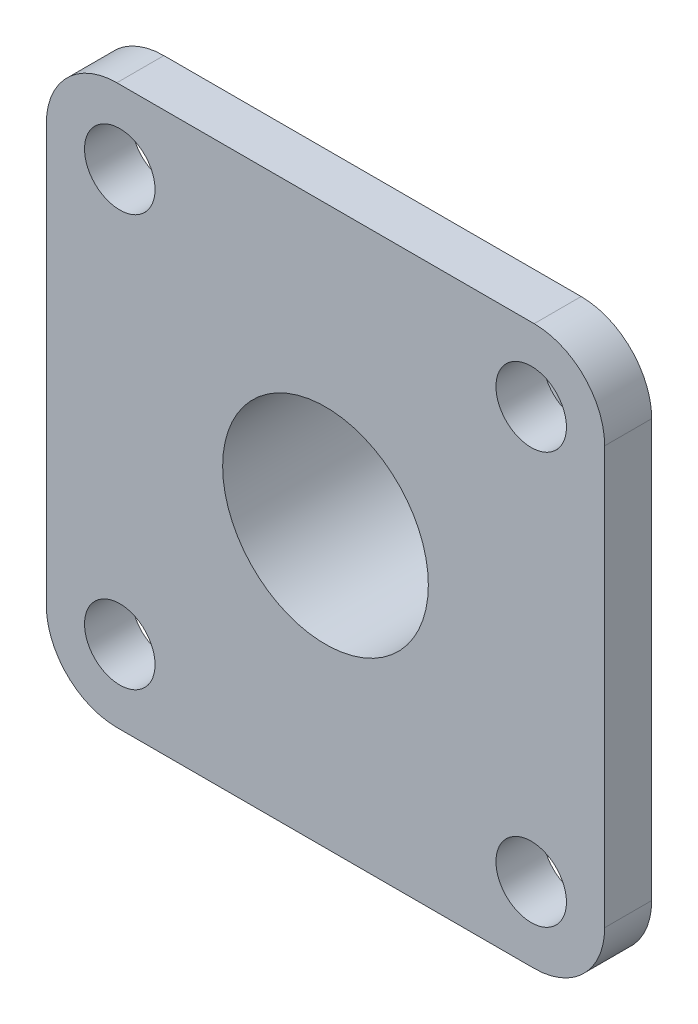
ISO-10303-21;
HEADER;
FILE_DESCRIPTION(('STEP AP214'),'2;1');
FILE_NAME('part.step','',(''),(''),'','','');
FILE_SCHEMA(('AUTOMOTIVE_DESIGN { 1 0 10303 214 1 1 1 1 }'));
ENDSEC;
DATA;
#1=APPLICATION_CONTEXT('core data for automotive mechanical design processes');
#2=APPLICATION_PROTOCOL_DEFINITION('international standard','automotive_design',2000,#1);
#3=PRODUCT_CONTEXT('',#1,'mechanical');
#4=PRODUCT('Part','Part','',(#3));
#5=PRODUCT_RELATED_PRODUCT_CATEGORY('part','',(#4));
#6=PRODUCT_DEFINITION_FORMATION('','',#4);
#7=PRODUCT_DEFINITION_CONTEXT('part definition',#1,'design');
#8=PRODUCT_DEFINITION('design','',#6,#7);
#9=PRODUCT_DEFINITION_SHAPE('','',#8);
#10=(LENGTH_UNIT() NAMED_UNIT(*) SI_UNIT(.MILLI.,.METRE.));
#11=(NAMED_UNIT(*) PLANE_ANGLE_UNIT() SI_UNIT($,.RADIAN.));
#12=(NAMED_UNIT(*) SI_UNIT($,.STERADIAN.) SOLID_ANGLE_UNIT());
#13=UNCERTAINTY_MEASURE_WITH_UNIT(LENGTH_MEASURE(1.E-05),#10,'distance_accuracy_value','');
#14=(GEOMETRIC_REPRESENTATION_CONTEXT(3) GLOBAL_UNCERTAINTY_ASSIGNED_CONTEXT((#13)) GLOBAL_UNIT_ASSIGNED_CONTEXT((#10,
#11,#12)) REPRESENTATION_CONTEXT('',''));
#15=CARTESIAN_POINT('',(0.,0.,0.));
#16=DIRECTION('',(0.,0.,1.));
#17=DIRECTION('',(1.,0.,0.));
#18=AXIS2_PLACEMENT_3D('',#15,#16,#17);
#19=CARTESIAN_POINT('',(-35.5,35.5,0.));
#20=DIRECTION('',(0.,0.,1.));
#21=DIRECTION('',(1.,0.,0.));
#22=AXIS2_PLACEMENT_3D('',#19,#20,#21);
#23=PLANE('',#22);
#24=CARTESIAN_POINT('',(-35.,35.,0.));
#25=DIRECTION('',(0.,0.,1.));
#26=DIRECTION('',(1.,0.,0.));
#27=AXIS2_PLACEMENT_3D('',#24,#25,#26);
#28=CIRCLE('',#27,6.);
#29=CARTESIAN_POINT('',(-29.,35.,0.));
#30=VERTEX_POINT('',#29);
#31=EDGE_CURVE('E202',#30,#30,#28,.T.);
#32=ORIENTED_EDGE('',*,*,#31,.T.);
#33=EDGE_LOOP('',(#32));
#34=FACE_BOUND('',#33,.T.);
#35=CARTESIAN_POINT('',(35.,35.,0.));
#36=DIRECTION('',(0.,0.,1.));
#37=DIRECTION('',(1.,0.,0.));
#38=AXIS2_PLACEMENT_3D('',#35,#36,#37);
#39=CIRCLE('',#38,6.);
#40=CARTESIAN_POINT('',(41.,35.,0.));
#41=VERTEX_POINT('',#40);
#42=EDGE_CURVE('E196',#41,#41,#39,.T.);
#43=ORIENTED_EDGE('',*,*,#42,.T.);
#44=EDGE_LOOP('',(#43));
#45=FACE_BOUND('',#44,.T.);
#46=CARTESIAN_POINT('',(35.,-35.,0.));
#47=DIRECTION('',(0.,0.,1.));
#48=DIRECTION('',(1.,0.,0.));
#49=AXIS2_PLACEMENT_3D('',#46,#47,#48);
#50=CIRCLE('',#49,6.00000000000001);
#51=CARTESIAN_POINT('',(41.,-35.,0.));
#52=VERTEX_POINT('',#51);
#53=EDGE_CURVE('E190',#52,#52,#50,.T.);
#54=ORIENTED_EDGE('',*,*,#53,.T.);
#55=EDGE_LOOP('',(#54));
#56=FACE_BOUND('',#55,.T.);
#57=CARTESIAN_POINT('',(-35.,-35.,0.));
#58=DIRECTION('',(0.,0.,1.));
#59=DIRECTION('',(1.,0.,0.));
#60=AXIS2_PLACEMENT_3D('',#57,#58,#59);
#61=CIRCLE('',#60,6.);
#62=CARTESIAN_POINT('',(-29.,-35.,0.));
#63=VERTEX_POINT('',#62);
#64=EDGE_CURVE('E184',#63,#63,#61,.T.);
#65=ORIENTED_EDGE('',*,*,#64,.T.);
#66=EDGE_LOOP('',(#65));
#67=FACE_BOUND('',#66,.T.);
#68=CARTESIAN_POINT('',(-35.5,35.5,0.));
#69=DIRECTION('',(0.,0.,1.));
#70=DIRECTION('',(1.,0.,0.));
#71=AXIS2_PLACEMENT_3D('',#68,#69,#70);
#72=CIRCLE('',#71,12.);
#73=CARTESIAN_POINT('',(-35.5,47.5,0.));
#74=VERTEX_POINT('',#73);
#75=CARTESIAN_POINT('',(-47.5,35.5,0.));
#76=VERTEX_POINT('',#75);
#77=EDGE_CURVE('E132',#74,#76,#72,.T.);
#78=ORIENTED_EDGE('',*,*,#77,.F.);
#79=DIRECTION('',(-1.,0.,0.));
#80=VECTOR('',#79,1.);
#81=CARTESIAN_POINT('',(35.5,47.5,0.));
#82=LINE('',#81,#80);
#83=CARTESIAN_POINT('',(35.5,47.5,0.));
#84=VERTEX_POINT('',#83);
#85=EDGE_CURVE('E85',#84,#74,#82,.T.);
#86=ORIENTED_EDGE('',*,*,#85,.F.);
#87=CARTESIAN_POINT('',(35.5,35.5,0.));
#88=DIRECTION('',(0.,0.,1.));
#89=DIRECTION('',(1.,0.,0.));
#90=AXIS2_PLACEMENT_3D('',#87,#88,#89);
#91=CIRCLE('',#90,12.);
#92=CARTESIAN_POINT('',(47.5,35.5,0.));
#93=VERTEX_POINT('',#92);
#94=EDGE_CURVE('E79',#93,#84,#91,.T.);
#95=ORIENTED_EDGE('',*,*,#94,.F.);
#96=DIRECTION('',(0.,1.,0.));
#97=VECTOR('',#96,1.);
#98=CARTESIAN_POINT('',(47.5,-35.5,0.));
#99=LINE('',#98,#97);
#100=CARTESIAN_POINT('',(47.5,-35.5,0.));
#101=VERTEX_POINT('',#100);
#102=EDGE_CURVE('E122',#101,#93,#99,.T.);
#103=ORIENTED_EDGE('',*,*,#102,.F.);
#104=CARTESIAN_POINT('',(35.5,-35.5,0.));
#105=DIRECTION('',(0.,0.,1.));
#106=DIRECTION('',(1.,0.,0.));
#107=AXIS2_PLACEMENT_3D('',#104,#105,#106);
#108=CIRCLE('',#107,12.);
#109=CARTESIAN_POINT('',(35.5,-47.5,0.));
#110=VERTEX_POINT('',#109);
#111=EDGE_CURVE('E142',#110,#101,#108,.T.);
#112=ORIENTED_EDGE('',*,*,#111,.F.);
#113=DIRECTION('',(1.,0.,0.));
#114=VECTOR('',#113,1.);
#115=CARTESIAN_POINT('',(35.5,-47.5,0.));
#116=LINE('',#115,#114);
#117=CARTESIAN_POINT('',(-35.5,-47.5,0.));
#118=VERTEX_POINT('',#117);
#119=EDGE_CURVE('E140',#118,#110,#116,.T.);
#120=ORIENTED_EDGE('',*,*,#119,.F.);
#121=CARTESIAN_POINT('',(-35.5,-35.5,0.));
#122=DIRECTION('',(0.,0.,1.));
#123=DIRECTION('',(-1.,0.,0.));
#124=AXIS2_PLACEMENT_3D('',#121,#122,#123);
#125=CIRCLE('',#124,12.);
#126=CARTESIAN_POINT('',(-47.5,-35.5,0.));
#127=VERTEX_POINT('',#126);
#128=EDGE_CURVE('E138',#127,#118,#125,.T.);
#129=ORIENTED_EDGE('',*,*,#128,.F.);
#130=DIRECTION('',(0.,-1.,0.));
#131=VECTOR('',#130,1.);
#132=CARTESIAN_POINT('',(-47.5,-35.5,0.));
#133=LINE('',#132,#131);
#134=EDGE_CURVE('E135',#76,#127,#133,.T.);
#135=ORIENTED_EDGE('',*,*,#134,.F.);
#136=EDGE_LOOP('',(#78,#86,#95,#103,#112,#120,#129,#135));
#137=FACE_BOUND('',#136,.T.);
#138=CARTESIAN_POINT('',(0.,0.,0.));
#139=DIRECTION('',(0.,0.,1.));
#140=DIRECTION('',(1.,0.,0.));
#141=AXIS2_PLACEMENT_3D('',#138,#139,#140);
#142=CIRCLE('',#141,27.5);
#143=CARTESIAN_POINT('',(27.5,0.,0.));
#144=VERTEX_POINT('',#143);
#145=EDGE_CURVE('E11',#144,#144,#142,.F.);
#146=ORIENTED_EDGE('',*,*,#145,.F.);
#147=EDGE_LOOP('',(#146));
#148=FACE_BOUND('',#147,.T.);
#149=ADVANCED_FACE('F33',(#34,#45,#56,#67,#137,#148),#23,.F.);
#150=CARTESIAN_POINT('',(-35.5,35.5,8.));
#151=DIRECTION('',(0.,0.,1.));
#152=DIRECTION('',(1.,0.,0.));
#153=AXIS2_PLACEMENT_3D('',#150,#151,#152);
#154=PLANE('',#153);
#155=CARTESIAN_POINT('',(-35.,35.,8.));
#156=DIRECTION('',(0.,0.,1.));
#157=DIRECTION('',(1.,0.,0.));
#158=AXIS2_PLACEMENT_3D('',#155,#156,#157);
#159=CIRCLE('',#158,6.);
#160=CARTESIAN_POINT('',(-29.,35.,8.));
#161=VERTEX_POINT('',#160);
#162=EDGE_CURVE('E199',#161,#161,#159,.T.);
#163=ORIENTED_EDGE('',*,*,#162,.F.);
#164=EDGE_LOOP('',(#163));
#165=FACE_BOUND('',#164,.T.);
#166=CARTESIAN_POINT('',(35.,-35.,8.));
#167=DIRECTION('',(0.,0.,1.));
#168=DIRECTION('',(1.,0.,0.));
#169=AXIS2_PLACEMENT_3D('',#166,#167,#168);
#170=CIRCLE('',#169,6.00000000000001);
#171=CARTESIAN_POINT('',(41.,-35.,8.));
#172=VERTEX_POINT('',#171);
#173=EDGE_CURVE('E187',#172,#172,#170,.T.);
#174=ORIENTED_EDGE('',*,*,#173,.F.);
#175=EDGE_LOOP('',(#174));
#176=FACE_BOUND('',#175,.T.);
#177=CARTESIAN_POINT('',(-35.5,35.5,8.));
#178=DIRECTION('',(0.,0.,1.));
#179=DIRECTION('',(1.,0.,0.));
#180=AXIS2_PLACEMENT_3D('',#177,#178,#179);
#181=CIRCLE('',#180,12.);
#182=CARTESIAN_POINT('',(-35.5,47.5,8.));
#183=VERTEX_POINT('',#182);
#184=CARTESIAN_POINT('',(-47.5,35.5,8.));
#185=VERTEX_POINT('',#184);
#186=EDGE_CURVE('E147',#183,#185,#181,.T.);
#187=ORIENTED_EDGE('',*,*,#186,.T.);
#188=DIRECTION('',(0.,-1.,0.));
#189=VECTOR('',#188,1.);
#190=CARTESIAN_POINT('',(-47.5,-35.5,8.));
#191=LINE('',#190,#189);
#192=CARTESIAN_POINT('',(-47.5,-35.5,8.));
#193=VERTEX_POINT('',#192);
#194=EDGE_CURVE('E94',#185,#193,#191,.T.);
#195=ORIENTED_EDGE('',*,*,#194,.T.);
#196=CARTESIAN_POINT('',(-35.5,-35.5,8.));
#197=DIRECTION('',(0.,0.,1.));
#198=DIRECTION('',(-1.,0.,0.));
#199=AXIS2_PLACEMENT_3D('',#196,#197,#198);
#200=CIRCLE('',#199,12.);
#201=CARTESIAN_POINT('',(-35.5,-47.5,8.));
#202=VERTEX_POINT('',#201);
#203=EDGE_CURVE('E178',#193,#202,#200,.T.);
#204=ORIENTED_EDGE('',*,*,#203,.T.);
#205=DIRECTION('',(1.,0.,0.));
#206=VECTOR('',#205,1.);
#207=CARTESIAN_POINT('',(35.5,-47.5,8.));
#208=LINE('',#207,#206);
#209=CARTESIAN_POINT('',(35.5,-47.5,8.));
#210=VERTEX_POINT('',#209);
#211=EDGE_CURVE('E177',#202,#210,#208,.T.);
#212=ORIENTED_EDGE('',*,*,#211,.T.);
#213=CARTESIAN_POINT('',(35.5,-35.5,8.));
#214=DIRECTION('',(0.,0.,1.));
#215=DIRECTION('',(1.,0.,0.));
#216=AXIS2_PLACEMENT_3D('',#213,#214,#215);
#217=CIRCLE('',#216,12.);
#218=CARTESIAN_POINT('',(47.5,-35.5,8.));
#219=VERTEX_POINT('',#218);
#220=EDGE_CURVE('E114',#210,#219,#217,.T.);
#221=ORIENTED_EDGE('',*,*,#220,.T.);
#222=DIRECTION('',(0.,1.,0.));
#223=VECTOR('',#222,1.);
#224=CARTESIAN_POINT('',(47.5,-35.5,8.));
#225=LINE('',#224,#223);
#226=CARTESIAN_POINT('',(47.5,35.5,8.));
#227=VERTEX_POINT('',#226);
#228=EDGE_CURVE('E107',#219,#227,#225,.T.);
#229=ORIENTED_EDGE('',*,*,#228,.T.);
#230=CARTESIAN_POINT('',(35.5,35.5,8.));
#231=DIRECTION('',(0.,0.,1.));
#232=DIRECTION('',(1.,0.,0.));
#233=AXIS2_PLACEMENT_3D('',#230,#231,#232);
#234=CIRCLE('',#233,12.);
#235=CARTESIAN_POINT('',(35.5,47.5,8.));
#236=VERTEX_POINT('',#235);
#237=EDGE_CURVE('E112',#227,#236,#234,.T.);
#238=ORIENTED_EDGE('',*,*,#237,.T.);
#239=DIRECTION('',(-1.,0.,0.));
#240=VECTOR('',#239,1.);
#241=CARTESIAN_POINT('',(35.5,47.5,8.));
#242=LINE('',#241,#240);
#243=EDGE_CURVE('E50',#236,#183,#242,.T.);
#244=ORIENTED_EDGE('',*,*,#243,.T.);
#245=EDGE_LOOP('',(#187,#195,#204,#212,#221,#229,#238,#244));
#246=FACE_BOUND('',#245,.T.);
#247=CARTESIAN_POINT('',(-35.,-35.,8.));
#248=DIRECTION('',(0.,0.,1.));
#249=DIRECTION('',(1.,0.,0.));
#250=AXIS2_PLACEMENT_3D('',#247,#248,#249);
#251=CIRCLE('',#250,6.);
#252=CARTESIAN_POINT('',(-29.,-35.,8.));
#253=VERTEX_POINT('',#252);
#254=EDGE_CURVE('E136',#253,#253,#251,.T.);
#255=ORIENTED_EDGE('',*,*,#254,.F.);
#256=EDGE_LOOP('',(#255));
#257=FACE_BOUND('',#256,.T.);
#258=CARTESIAN_POINT('',(35.,35.,8.));
#259=DIRECTION('',(0.,0.,1.));
#260=DIRECTION('',(1.,0.,0.));
#261=AXIS2_PLACEMENT_3D('',#258,#259,#260);
#262=CIRCLE('',#261,6.);
#263=CARTESIAN_POINT('',(41.,35.,8.));
#264=VERTEX_POINT('',#263);
#265=EDGE_CURVE('E193',#264,#264,#262,.T.);
#266=ORIENTED_EDGE('',*,*,#265,.F.);
#267=EDGE_LOOP('',(#266));
#268=FACE_BOUND('',#267,.T.);
#269=CARTESIAN_POINT('',(0.,0.,8.));
#270=DIRECTION('',(0.,0.,1.));
#271=DIRECTION('',(1.,0.,0.));
#272=AXIS2_PLACEMENT_3D('',#269,#270,#271);
#273=CIRCLE('',#272,17.5);
#274=CARTESIAN_POINT('',(17.5,0.,8.));
#275=VERTEX_POINT('',#274);
#276=EDGE_CURVE('E205',#275,#275,#273,.T.);
#277=ORIENTED_EDGE('',*,*,#276,.F.);
#278=EDGE_LOOP('',(#277));
#279=FACE_BOUND('',#278,.T.);
#280=ADVANCED_FACE('F109',(#165,#176,#246,#257,#268,#279),#154,.T.);
#281=CARTESIAN_POINT('',(-35.5,35.5,8.));
#282=DIRECTION('',(0.,0.,-1.));
#283=DIRECTION('',(-1.,0.,0.));
#284=AXIS2_PLACEMENT_3D('',#281,#282,#283);
#285=CYLINDRICAL_SURFACE('',#284,12.);
#286=ORIENTED_EDGE('',*,*,#77,.T.);
#287=DIRECTION('',(0.,0.,-1.));
#288=VECTOR('',#287,1.);
#289=CARTESIAN_POINT('',(-47.5,35.5,8.));
#290=LINE('',#289,#288);
#291=EDGE_CURVE('E42',#185,#76,#290,.T.);
#292=ORIENTED_EDGE('',*,*,#291,.F.);
#293=ORIENTED_EDGE('',*,*,#186,.F.);
#294=DIRECTION('',(0.,0.,-1.));
#295=VECTOR('',#294,1.);
#296=CARTESIAN_POINT('',(-35.5,47.5,8.));
#297=LINE('',#296,#295);
#298=EDGE_CURVE('E128',#183,#74,#297,.T.);
#299=ORIENTED_EDGE('',*,*,#298,.T.);
#300=EDGE_LOOP('',(#286,#292,#293,#299));
#301=FACE_BOUND('',#300,.T.);
#302=ADVANCED_FACE('F35',(#301),#285,.T.);
#303=CARTESIAN_POINT('',(-47.5,-35.5,8.));
#304=DIRECTION('',(1.,0.,0.));
#305=DIRECTION('',(0.,1.,0.));
#306=AXIS2_PLACEMENT_3D('',#303,#304,#305);
#307=PLANE('',#306);
#308=ORIENTED_EDGE('',*,*,#134,.T.);
#309=DIRECTION('',(0.,0.,-1.));
#310=VECTOR('',#309,1.);
#311=CARTESIAN_POINT('',(-47.5,-35.5,8.));
#312=LINE('',#311,#310);
#313=EDGE_CURVE('E157',#193,#127,#312,.T.);
#314=ORIENTED_EDGE('',*,*,#313,.F.);
#315=ORIENTED_EDGE('',*,*,#194,.F.);
#316=ORIENTED_EDGE('',*,*,#291,.T.);
#317=EDGE_LOOP('',(#308,#314,#315,#316));
#318=FACE_BOUND('',#317,.T.);
#319=ADVANCED_FACE('F160',(#318),#307,.F.);
#320=CARTESIAN_POINT('',(-35.5,-35.5,8.));
#321=DIRECTION('',(0.,0.,-1.));
#322=DIRECTION('',(-1.,0.,0.));
#323=AXIS2_PLACEMENT_3D('',#320,#321,#322);
#324=CYLINDRICAL_SURFACE('',#323,12.);
#325=ORIENTED_EDGE('',*,*,#128,.T.);
#326=DIRECTION('',(0.,0.,-1.));
#327=VECTOR('',#326,1.);
#328=CARTESIAN_POINT('',(-35.5,-47.5,8.));
#329=LINE('',#328,#327);
#330=EDGE_CURVE('E154',#202,#118,#329,.T.);
#331=ORIENTED_EDGE('',*,*,#330,.F.);
#332=ORIENTED_EDGE('',*,*,#203,.F.);
#333=ORIENTED_EDGE('',*,*,#313,.T.);
#334=EDGE_LOOP('',(#325,#331,#332,#333));
#335=FACE_BOUND('',#334,.T.);
#336=ADVANCED_FACE('F171',(#335),#324,.T.);
#337=CARTESIAN_POINT('',(35.5,-47.5,8.));
#338=DIRECTION('',(0.,1.,0.));
#339=DIRECTION('',(0.,0.,1.));
#340=AXIS2_PLACEMENT_3D('',#337,#338,#339);
#341=PLANE('',#340);
#342=ORIENTED_EDGE('',*,*,#119,.T.);
#343=DIRECTION('',(0.,0.,-1.));
#344=VECTOR('',#343,1.);
#345=CARTESIAN_POINT('',(35.5,-47.5,8.));
#346=LINE('',#345,#344);
#347=EDGE_CURVE('E151',#210,#110,#346,.T.);
#348=ORIENTED_EDGE('',*,*,#347,.F.);
#349=ORIENTED_EDGE('',*,*,#211,.F.);
#350=ORIENTED_EDGE('',*,*,#330,.T.);
#351=EDGE_LOOP('',(#342,#348,#349,#350));
#352=FACE_BOUND('',#351,.T.);
#353=ADVANCED_FACE('F175',(#352),#341,.F.);
#354=CARTESIAN_POINT('',(35.5,-35.5,8.));
#355=DIRECTION('',(0.,0.,-1.));
#356=DIRECTION('',(-1.,0.,0.));
#357=AXIS2_PLACEMENT_3D('',#354,#355,#356);
#358=CYLINDRICAL_SURFACE('',#357,12.);
#359=ORIENTED_EDGE('',*,*,#111,.T.);
#360=DIRECTION('',(0.,0.,-1.));
#361=VECTOR('',#360,1.);
#362=CARTESIAN_POINT('',(47.5,-35.5,8.));
#363=LINE('',#362,#361);
#364=EDGE_CURVE('E123',#219,#101,#363,.T.);
#365=ORIENTED_EDGE('',*,*,#364,.F.);
#366=ORIENTED_EDGE('',*,*,#220,.F.);
#367=ORIENTED_EDGE('',*,*,#347,.T.);
#368=EDGE_LOOP('',(#359,#365,#366,#367));
#369=FACE_BOUND('',#368,.T.);
#370=ADVANCED_FACE('F252',(#369),#358,.T.);
#371=CARTESIAN_POINT('',(47.5,-35.5,8.));
#372=DIRECTION('',(-1.,0.,0.));
#373=DIRECTION('',(0.,0.,1.));
#374=AXIS2_PLACEMENT_3D('',#371,#372,#373);
#375=PLANE('',#374);
#376=ORIENTED_EDGE('',*,*,#102,.T.);
#377=DIRECTION('',(0.,0.,-1.));
#378=VECTOR('',#377,1.);
#379=CARTESIAN_POINT('',(47.5,35.5,8.));
#380=LINE('',#379,#378);
#381=EDGE_CURVE('E119',#227,#93,#380,.T.);
#382=ORIENTED_EDGE('',*,*,#381,.F.);
#383=ORIENTED_EDGE('',*,*,#228,.F.);
#384=ORIENTED_EDGE('',*,*,#364,.T.);
#385=EDGE_LOOP('',(#376,#382,#383,#384));
#386=FACE_BOUND('',#385,.T.);
#387=ADVANCED_FACE('F120',(#386),#375,.F.);
#388=CARTESIAN_POINT('',(35.5,35.5,8.));
#389=DIRECTION('',(0.,0.,-1.));
#390=DIRECTION('',(-1.,0.,0.));
#391=AXIS2_PLACEMENT_3D('',#388,#389,#390);
#392=CYLINDRICAL_SURFACE('',#391,12.);
#393=ORIENTED_EDGE('',*,*,#94,.T.);
#394=DIRECTION('',(0.,0.,-1.));
#395=VECTOR('',#394,1.);
#396=CARTESIAN_POINT('',(35.5,47.5,8.));
#397=LINE('',#396,#395);
#398=EDGE_CURVE('E124',#236,#84,#397,.T.);
#399=ORIENTED_EDGE('',*,*,#398,.F.);
#400=ORIENTED_EDGE('',*,*,#237,.F.);
#401=ORIENTED_EDGE('',*,*,#381,.T.);
#402=EDGE_LOOP('',(#393,#399,#400,#401));
#403=FACE_BOUND('',#402,.T.);
#404=ADVANCED_FACE('F126',(#403),#392,.T.);
#405=CARTESIAN_POINT('',(35.5,47.5,8.));
#406=DIRECTION('',(0.,-1.,0.));
#407=DIRECTION('',(0.,0.,-1.));
#408=AXIS2_PLACEMENT_3D('',#405,#406,#407);
#409=PLANE('',#408);
#410=ORIENTED_EDGE('',*,*,#85,.T.);
#411=ORIENTED_EDGE('',*,*,#298,.F.);
#412=ORIENTED_EDGE('',*,*,#243,.F.);
#413=ORIENTED_EDGE('',*,*,#398,.T.);
#414=EDGE_LOOP('',(#410,#411,#412,#413));
#415=FACE_BOUND('',#414,.T.);
#416=ADVANCED_FACE('F244',(#415),#409,.F.);
#417=CARTESIAN_POINT('',(-35.,-35.,8.));
#418=DIRECTION('',(0.,0.,-1.));
#419=DIRECTION('',(-1.,0.,0.));
#420=AXIS2_PLACEMENT_3D('',#417,#418,#419);
#421=CYLINDRICAL_SURFACE('',#420,6.);
#422=ORIENTED_EDGE('',*,*,#254,.T.);
#423=EDGE_LOOP('',(#422));
#424=FACE_BOUND('',#423,.T.);
#425=ORIENTED_EDGE('',*,*,#64,.F.);
#426=EDGE_LOOP('',(#425));
#427=FACE_BOUND('',#426,.T.);
#428=ADVANCED_FACE('F247',(#424,#427),#421,.F.);
#429=CARTESIAN_POINT('',(35.,-35.,8.));
#430=DIRECTION('',(0.,0.,-1.));
#431=DIRECTION('',(-1.,0.,0.));
#432=AXIS2_PLACEMENT_3D('',#429,#430,#431);
#433=CYLINDRICAL_SURFACE('',#432,6.00000000000001);
#434=ORIENTED_EDGE('',*,*,#173,.T.);
#435=EDGE_LOOP('',(#434));
#436=FACE_BOUND('',#435,.T.);
#437=ORIENTED_EDGE('',*,*,#53,.F.);
#438=EDGE_LOOP('',(#437));
#439=FACE_BOUND('',#438,.T.);
#440=ADVANCED_FACE('F315',(#436,#439),#433,.F.);
#441=CARTESIAN_POINT('',(35.,35.,8.));
#442=DIRECTION('',(0.,0.,-1.));
#443=DIRECTION('',(-1.,0.,0.));
#444=AXIS2_PLACEMENT_3D('',#441,#442,#443);
#445=CYLINDRICAL_SURFACE('',#444,6.);
#446=ORIENTED_EDGE('',*,*,#265,.T.);
#447=EDGE_LOOP('',(#446));
#448=FACE_BOUND('',#447,.T.);
#449=ORIENTED_EDGE('',*,*,#42,.F.);
#450=EDGE_LOOP('',(#449));
#451=FACE_BOUND('',#450,.T.);
#452=ADVANCED_FACE('F323',(#448,#451),#445,.F.);
#453=CARTESIAN_POINT('',(-35.,35.,8.));
#454=DIRECTION('',(0.,0.,-1.));
#455=DIRECTION('',(-1.,0.,0.));
#456=AXIS2_PLACEMENT_3D('',#453,#454,#455);
#457=CYLINDRICAL_SURFACE('',#456,6.);
#458=ORIENTED_EDGE('',*,*,#162,.T.);
#459=EDGE_LOOP('',(#458));
#460=FACE_BOUND('',#459,.T.);
#461=ORIENTED_EDGE('',*,*,#31,.F.);
#462=EDGE_LOOP('',(#461));
#463=FACE_BOUND('',#462,.T.);
#464=ADVANCED_FACE('F230',(#460,#463),#457,.F.);
#465=CARTESIAN_POINT('',(0.,0.,8.));
#466=DIRECTION('',(0.,0.,-1.));
#467=DIRECTION('',(-1.,0.,0.));
#468=AXIS2_PLACEMENT_3D('',#465,#466,#467);
#469=CYLINDRICAL_SURFACE('',#468,17.5);
#470=ORIENTED_EDGE('',*,*,#276,.T.);
#471=EDGE_LOOP('',(#470));
#472=FACE_BOUND('',#471,.T.);
#473=CARTESIAN_POINT('',(0.,0.,-20.));
#474=DIRECTION('',(0.,0.,-1.));
#475=DIRECTION('',(-1.,0.,0.));
#476=AXIS2_PLACEMENT_3D('',#473,#474,#475);
#477=CIRCLE('',#476,17.5);
#478=CARTESIAN_POINT('',(-17.5,0.,-20.));
#479=VERTEX_POINT('',#478);
#480=EDGE_CURVE('E213',#479,#479,#477,.T.);
#481=ORIENTED_EDGE('',*,*,#480,.T.);
#482=EDGE_LOOP('',(#481));
#483=FACE_BOUND('',#482,.T.);
#484=ADVANCED_FACE('F217',(#472,#483),#469,.F.);
#485=CARTESIAN_POINT('',(0.,0.,-20.));
#486=DIRECTION('',(0.,0.,-1.));
#487=DIRECTION('',(-1.,0.,0.));
#488=AXIS2_PLACEMENT_3D('',#485,#486,#487);
#489=PLANE('',#488);
#490=CARTESIAN_POINT('',(0.,0.,-20.));
#491=DIRECTION('',(0.,0.,-1.));
#492=DIRECTION('',(-1.,0.,0.));
#493=AXIS2_PLACEMENT_3D('',#490,#491,#492);
#494=CIRCLE('',#493,27.5);
#495=CARTESIAN_POINT('',(-27.5,0.,-20.));
#496=VERTEX_POINT('',#495);
#497=EDGE_CURVE('E210',#496,#496,#494,.T.);
#498=ORIENTED_EDGE('',*,*,#497,.T.);
#499=EDGE_LOOP('',(#498));
#500=FACE_BOUND('',#499,.T.);
#501=ORIENTED_EDGE('',*,*,#480,.F.);
#502=EDGE_LOOP('',(#501));
#503=FACE_BOUND('',#502,.T.);
#504=ADVANCED_FACE('F219',(#500,#503),#489,.T.);
#505=CARTESIAN_POINT('',(0.,0.,-20.));
#506=DIRECTION('',(0.,0.,1.));
#507=DIRECTION('',(1.,0.,0.));
#508=AXIS2_PLACEMENT_3D('',#505,#506,#507);
#509=CYLINDRICAL_SURFACE('',#508,27.5);
#510=ORIENTED_EDGE('',*,*,#497,.F.);
#511=EDGE_LOOP('',(#510));
#512=FACE_BOUND('',#511,.T.);
#513=ORIENTED_EDGE('',*,*,#145,.T.);
#514=EDGE_LOOP('',(#513));
#515=FACE_BOUND('',#514,.T.);
#516=ADVANCED_FACE('F221',(#512,#515),#509,.T.);
#517=CLOSED_SHELL('',(#149,#280,#302,#319,#336,#353,#370,#387,#404,#416,#428,#440,#452,#464,
#484,#504,#516));
#518=MANIFOLD_SOLID_BREP('B2',#517);
#519=ADVANCED_BREP_SHAPE_REPRESENTATION('',(#18,#518),#14);
#520=SHAPE_DEFINITION_REPRESENTATION(#9,#519);
ENDSEC;
END-ISO-10303-21;
